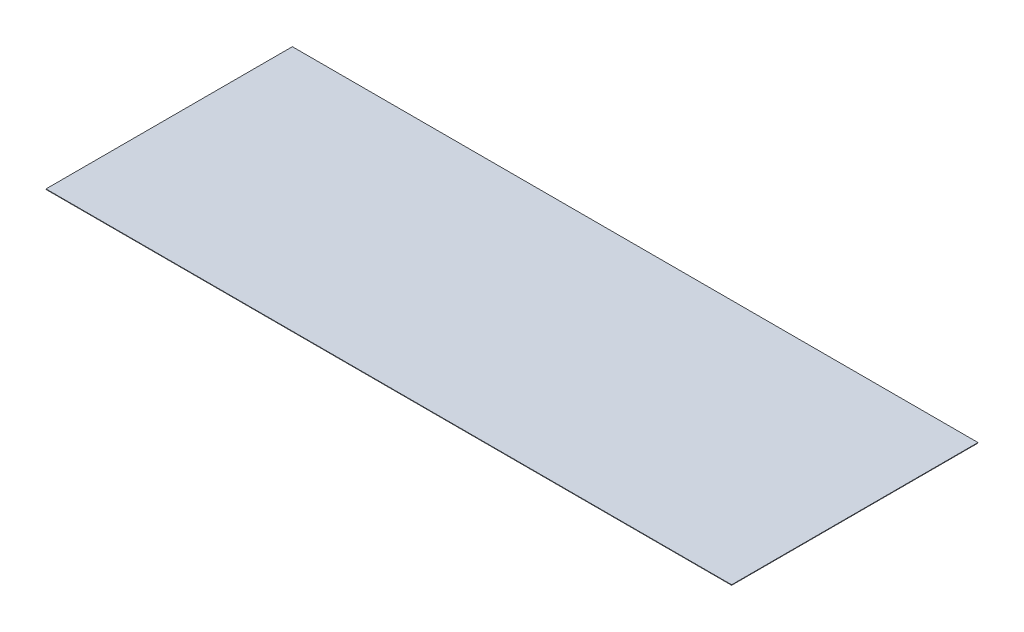
ISO-10303-21;
HEADER;
FILE_DESCRIPTION(('STEP AP214'),'2;1');
FILE_NAME('part.step','',(''),(''),'','','');
FILE_SCHEMA(('AUTOMOTIVE_DESIGN { 1 0 10303 214 1 1 1 1 }'));
ENDSEC;
DATA;
#1=APPLICATION_CONTEXT('core data for automotive mechanical design processes');
#2=APPLICATION_PROTOCOL_DEFINITION('international standard','automotive_design',2000,#1);
#3=PRODUCT_CONTEXT('',#1,'mechanical');
#4=PRODUCT('Part','Part','',(#3));
#5=PRODUCT_RELATED_PRODUCT_CATEGORY('part','',(#4));
#6=PRODUCT_DEFINITION_FORMATION('','',#4);
#7=PRODUCT_DEFINITION_CONTEXT('part definition',#1,'design');
#8=PRODUCT_DEFINITION('design','',#6,#7);
#9=PRODUCT_DEFINITION_SHAPE('','',#8);
#10=(LENGTH_UNIT() NAMED_UNIT(*) SI_UNIT(.MILLI.,.METRE.));
#11=(NAMED_UNIT(*) PLANE_ANGLE_UNIT() SI_UNIT($,.RADIAN.));
#12=(NAMED_UNIT(*) SI_UNIT($,.STERADIAN.) SOLID_ANGLE_UNIT());
#13=UNCERTAINTY_MEASURE_WITH_UNIT(LENGTH_MEASURE(1.E-05),#10,'distance_accuracy_value','');
#14=(GEOMETRIC_REPRESENTATION_CONTEXT(3) GLOBAL_UNCERTAINTY_ASSIGNED_CONTEXT((#13)) GLOBAL_UNIT_ASSIGNED_CONTEXT((#10,
#11,#12)) REPRESENTATION_CONTEXT('',''));
#15=CARTESIAN_POINT('',(0.,0.,0.));
#16=DIRECTION('',(0.,0.,1.));
#17=DIRECTION('',(1.,0.,0.));
#18=AXIS2_PLACEMENT_3D('',#15,#16,#17);
#19=CARTESIAN_POINT('',(-56.5,0.08,20.3));
#20=DIRECTION('',(1.,0.,0.));
#21=DIRECTION('',(0.,0.,-1.));
#22=AXIS2_PLACEMENT_3D('',#19,#20,#21);
#23=PLANE('',#22);
#24=DIRECTION('',(0.,0.,1.));
#25=VECTOR('',#24,1.);
#26=CARTESIAN_POINT('',(-56.5,0.,20.3));
#27=LINE('',#26,#25);
#28=CARTESIAN_POINT('',(-56.5,0.,-20.3));
#29=VERTEX_POINT('',#28);
#30=CARTESIAN_POINT('',(-56.5,0.,20.3));
#31=VERTEX_POINT('',#30);
#32=EDGE_CURVE('E95',#29,#31,#27,.T.);
#33=ORIENTED_EDGE('',*,*,#32,.T.);
#34=DIRECTION('',(0.,-1.,0.));
#35=VECTOR('',#34,1.);
#36=CARTESIAN_POINT('',(-56.5,0.08,20.3));
#37=LINE('',#36,#35);
#38=CARTESIAN_POINT('',(-56.5,0.08,20.3));
#39=VERTEX_POINT('',#38);
#40=EDGE_CURVE('E11',#39,#31,#37,.T.);
#41=ORIENTED_EDGE('',*,*,#40,.F.);
#42=DIRECTION('',(0.,0.,1.));
#43=VECTOR('',#42,1.);
#44=CARTESIAN_POINT('',(-56.5,0.08,20.3));
#45=LINE('',#44,#43);
#46=CARTESIAN_POINT('',(-56.5,0.08,-20.3));
#47=VERTEX_POINT('',#46);
#48=EDGE_CURVE('E83',#47,#39,#45,.T.);
#49=ORIENTED_EDGE('',*,*,#48,.F.);
#50=DIRECTION('',(0.,-1.,0.));
#51=VECTOR('',#50,1.);
#52=CARTESIAN_POINT('',(-56.5,0.08,-20.3));
#53=LINE('',#52,#51);
#54=EDGE_CURVE('E91',#47,#29,#53,.T.);
#55=ORIENTED_EDGE('',*,*,#54,.T.);
#56=EDGE_LOOP('',(#33,#41,#49,#55));
#57=FACE_BOUND('',#56,.T.);
#58=ADVANCED_FACE('F32',(#57),#23,.F.);
#59=CARTESIAN_POINT('',(56.5,0.08,20.3));
#60=DIRECTION('',(0.,0.,-1.));
#61=DIRECTION('',(-1.,0.,0.));
#62=AXIS2_PLACEMENT_3D('',#59,#60,#61);
#63=PLANE('',#62);
#64=DIRECTION('',(1.,0.,0.));
#65=VECTOR('',#64,1.);
#66=CARTESIAN_POINT('',(56.5,0.,20.3));
#67=LINE('',#66,#65);
#68=CARTESIAN_POINT('',(56.5,0.,20.3));
#69=VERTEX_POINT('',#68);
#70=EDGE_CURVE('E87',#31,#69,#67,.T.);
#71=ORIENTED_EDGE('',*,*,#70,.T.);
#72=DIRECTION('',(0.,-1.,0.));
#73=VECTOR('',#72,1.);
#74=CARTESIAN_POINT('',(56.5,0.08,20.3));
#75=LINE('',#74,#73);
#76=CARTESIAN_POINT('',(56.5,0.08,20.3));
#77=VERTEX_POINT('',#76);
#78=EDGE_CURVE('E40',#77,#69,#75,.T.);
#79=ORIENTED_EDGE('',*,*,#78,.F.);
#80=DIRECTION('',(1.,0.,0.));
#81=VECTOR('',#80,1.);
#82=CARTESIAN_POINT('',(56.5,0.08,20.3));
#83=LINE('',#82,#81);
#84=EDGE_CURVE('E78',#39,#77,#83,.T.);
#85=ORIENTED_EDGE('',*,*,#84,.F.);
#86=ORIENTED_EDGE('',*,*,#40,.T.);
#87=EDGE_LOOP('',(#71,#79,#85,#86));
#88=FACE_BOUND('',#87,.T.);
#89=ADVANCED_FACE('F86',(#88),#63,.F.);
#90=CARTESIAN_POINT('',(56.5,0.08,20.3));
#91=DIRECTION('',(-1.,0.,0.));
#92=DIRECTION('',(0.,0.,1.));
#93=AXIS2_PLACEMENT_3D('',#90,#91,#92);
#94=PLANE('',#93);
#95=DIRECTION('',(0.,0.,-1.));
#96=VECTOR('',#95,1.);
#97=CARTESIAN_POINT('',(56.5,0.,20.3));
#98=LINE('',#97,#96);
#99=CARTESIAN_POINT('',(56.5,0.,-20.3));
#100=VERTEX_POINT('',#99);
#101=EDGE_CURVE('E65',#69,#100,#98,.T.);
#102=ORIENTED_EDGE('',*,*,#101,.T.);
#103=DIRECTION('',(0.,-1.,0.));
#104=VECTOR('',#103,1.);
#105=CARTESIAN_POINT('',(56.5,0.08,-20.3));
#106=LINE('',#105,#104);
#107=CARTESIAN_POINT('',(56.5,0.08,-20.3));
#108=VERTEX_POINT('',#107);
#109=EDGE_CURVE('E88',#108,#100,#106,.T.);
#110=ORIENTED_EDGE('',*,*,#109,.F.);
#111=DIRECTION('',(0.,0.,-1.));
#112=VECTOR('',#111,1.);
#113=CARTESIAN_POINT('',(56.5,0.08,20.3));
#114=LINE('',#113,#112);
#115=EDGE_CURVE('E81',#77,#108,#114,.T.);
#116=ORIENTED_EDGE('',*,*,#115,.F.);
#117=ORIENTED_EDGE('',*,*,#78,.T.);
#118=EDGE_LOOP('',(#102,#110,#116,#117));
#119=FACE_BOUND('',#118,.T.);
#120=ADVANCED_FACE('F89',(#119),#94,.F.);
#121=CARTESIAN_POINT('',(56.5,0.08,-20.3));
#122=DIRECTION('',(0.,0.,1.));
#123=DIRECTION('',(1.,0.,0.));
#124=AXIS2_PLACEMENT_3D('',#121,#122,#123);
#125=PLANE('',#124);
#126=DIRECTION('',(-1.,0.,0.));
#127=VECTOR('',#126,1.);
#128=CARTESIAN_POINT('',(56.5,0.,-20.3));
#129=LINE('',#128,#127);
#130=EDGE_CURVE('E71',#100,#29,#129,.T.);
#131=ORIENTED_EDGE('',*,*,#130,.T.);
#132=ORIENTED_EDGE('',*,*,#54,.F.);
#133=DIRECTION('',(-1.,0.,0.));
#134=VECTOR('',#133,1.);
#135=CARTESIAN_POINT('',(56.5,0.08,-20.3));
#136=LINE('',#135,#134);
#137=EDGE_CURVE('E48',#108,#47,#136,.T.);
#138=ORIENTED_EDGE('',*,*,#137,.F.);
#139=ORIENTED_EDGE('',*,*,#109,.T.);
#140=EDGE_LOOP('',(#131,#132,#138,#139));
#141=FACE_BOUND('',#140,.T.);
#142=ADVANCED_FACE('F102',(#141),#125,.F.);
#143=CARTESIAN_POINT('',(0.,0.08,0.));
#144=DIRECTION('',(0.,1.,0.));
#145=DIRECTION('',(0.,0.,1.));
#146=AXIS2_PLACEMENT_3D('',#143,#144,#145);
#147=PLANE('',#146);
#148=ORIENTED_EDGE('',*,*,#48,.T.);
#149=ORIENTED_EDGE('',*,*,#84,.T.);
#150=ORIENTED_EDGE('',*,*,#115,.T.);
#151=ORIENTED_EDGE('',*,*,#137,.T.);
#152=EDGE_LOOP('',(#148,#149,#150,#151));
#153=FACE_BOUND('',#152,.T.);
#154=ADVANCED_FACE('F79',(#153),#147,.T.);
#155=CARTESIAN_POINT('',(0.,0.,0.));
#156=DIRECTION('',(0.,1.,0.));
#157=DIRECTION('',(0.,0.,1.));
#158=AXIS2_PLACEMENT_3D('',#155,#156,#157);
#159=PLANE('',#158);
#160=ORIENTED_EDGE('',*,*,#32,.F.);
#161=ORIENTED_EDGE('',*,*,#130,.F.);
#162=ORIENTED_EDGE('',*,*,#101,.F.);
#163=ORIENTED_EDGE('',*,*,#70,.F.);
#164=EDGE_LOOP('',(#160,#161,#162,#163));
#165=FACE_BOUND('',#164,.T.);
#166=ADVANCED_FACE('F105',(#165),#159,.F.);
#167=CLOSED_SHELL('',(#58,#89,#120,#142,#154,#166));
#168=MANIFOLD_SOLID_BREP('B2',#167);
#169=ADVANCED_BREP_SHAPE_REPRESENTATION('',(#18,#168),#14);
#170=SHAPE_DEFINITION_REPRESENTATION(#9,#169);
ENDSEC;
END-ISO-10303-21;
